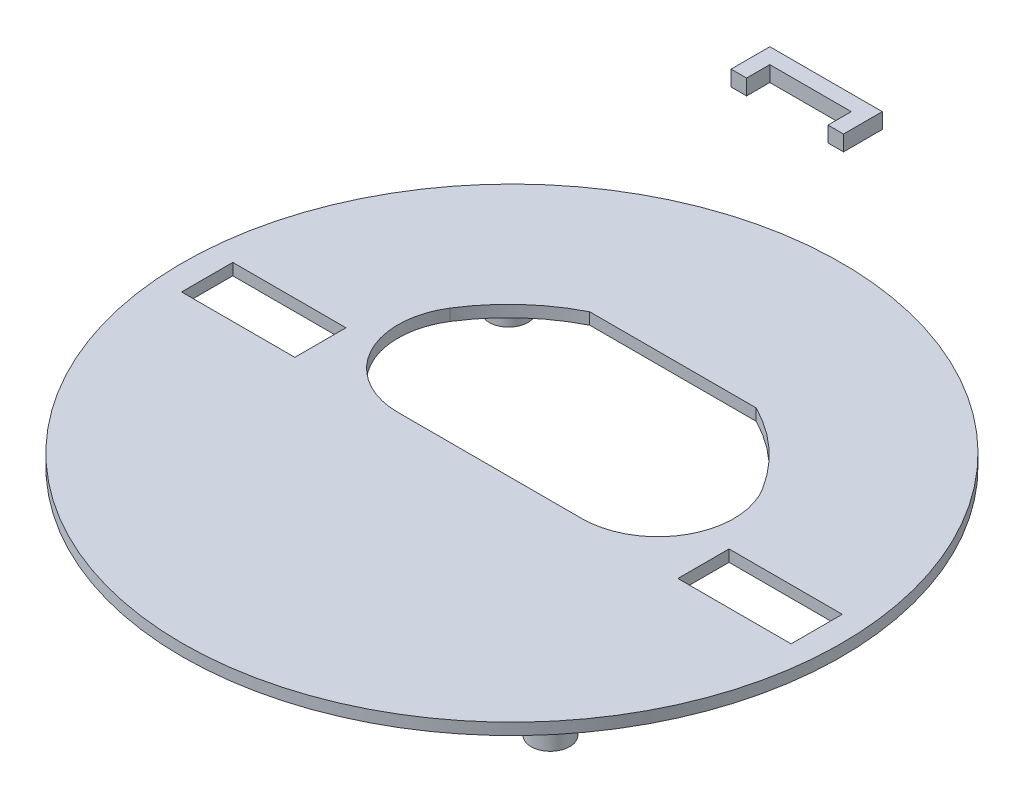
ISO-10303-21;
HEADER;
FILE_DESCRIPTION(('STEP AP214'),'2;1');
FILE_NAME('part.step','',(''),(''),'','','');
FILE_SCHEMA(('AUTOMOTIVE_DESIGN { 1 0 10303 214 1 1 1 1 }'));
ENDSEC;
DATA;
#1=APPLICATION_CONTEXT('core data for automotive mechanical design processes');
#2=APPLICATION_PROTOCOL_DEFINITION('international standard','automotive_design',2000,#1);
#3=PRODUCT_CONTEXT('',#1,'mechanical');
#4=PRODUCT('Part','Part','',(#3));
#5=PRODUCT_RELATED_PRODUCT_CATEGORY('part','',(#4));
#6=PRODUCT_DEFINITION_FORMATION('','',#4);
#7=PRODUCT_DEFINITION_CONTEXT('part definition',#1,'design');
#8=PRODUCT_DEFINITION('design','',#6,#7);
#9=PRODUCT_DEFINITION_SHAPE('','',#8);
#10=(LENGTH_UNIT() NAMED_UNIT(*) SI_UNIT(.MILLI.,.METRE.));
#11=(NAMED_UNIT(*) PLANE_ANGLE_UNIT() SI_UNIT($,.RADIAN.));
#12=(NAMED_UNIT(*) SI_UNIT($,.STERADIAN.) SOLID_ANGLE_UNIT());
#13=UNCERTAINTY_MEASURE_WITH_UNIT(LENGTH_MEASURE(1.E-05),#10,'distance_accuracy_value','');
#14=(GEOMETRIC_REPRESENTATION_CONTEXT(3) GLOBAL_UNCERTAINTY_ASSIGNED_CONTEXT((#13)) GLOBAL_UNIT_ASSIGNED_CONTEXT((#10,
#11,#12)) REPRESENTATION_CONTEXT('',''));
#15=CARTESIAN_POINT('',(0.,0.,0.));
#16=DIRECTION('',(0.,0.,1.));
#17=DIRECTION('',(1.,0.,0.));
#18=AXIS2_PLACEMENT_3D('',#15,#16,#17);
#19=CARTESIAN_POINT('',(0.,16.,0.));
#20=DIRECTION('',(0.,1.,0.));
#21=DIRECTION('',(0.,0.,1.));
#22=AXIS2_PLACEMENT_3D('',#19,#20,#21);
#23=PLANE('',#22);
#24=CARTESIAN_POINT('',(26.517708618087,16.,-23.1203329879293));
#25=DIRECTION('',(0.,1.,0.));
#26=DIRECTION('',(0.,0.,1.));
#27=AXIS2_PLACEMENT_3D('',#24,#25,#26);
#28=CIRCLE('',#27,2.5);
#29=CARTESIAN_POINT('',(26.517708618087,16.,-20.6203329879293));
#30=VERTEX_POINT('',#29);
#31=EDGE_CURVE('E13',#30,#30,#28,.F.);
#32=ORIENTED_EDGE('',*,*,#31,.F.);
#33=EDGE_LOOP('',(#32));
#34=FACE_BOUND('',#33,.T.);
#35=CARTESIAN_POINT('',(0.,16.,-30.8231453174272));
#36=DIRECTION('',(0.,1.,0.));
#37=DIRECTION('',(0.,0.,1.));
#38=AXIS2_PLACEMENT_3D('',#35,#36,#37);
#39=CIRCLE('',#38,2.5);
#40=CARTESIAN_POINT('',(0.,16.,-28.3231453174272));
#41=VERTEX_POINT('',#40);
#42=EDGE_CURVE('E55',#41,#41,#39,.F.);
#43=ORIENTED_EDGE('',*,*,#42,.F.);
#44=EDGE_LOOP('',(#43));
#45=FACE_BOUND('',#44,.T.);
#46=CARTESIAN_POINT('',(-23.5506451824083,16.,-23.1203329879293));
#47=DIRECTION('',(0.,1.,0.));
#48=DIRECTION('',(0.,0.,1.));
#49=AXIS2_PLACEMENT_3D('',#46,#47,#48);
#50=CIRCLE('',#49,2.5);
#51=CARTESIAN_POINT('',(-23.5506451824083,16.,-20.6203329879293));
#52=VERTEX_POINT('',#51);
#53=EDGE_CURVE('E292',#52,#52,#50,.F.);
#54=ORIENTED_EDGE('',*,*,#53,.F.);
#55=EDGE_LOOP('',(#54));
#56=FACE_BOUND('',#55,.T.);
#57=CARTESIAN_POINT('',(-26.0780813753172,16.,19.2039653158604));
#58=DIRECTION('',(0.,1.,0.));
#59=DIRECTION('',(0.,0.,1.));
#60=AXIS2_PLACEMENT_3D('',#57,#58,#59);
#61=CIRCLE('',#60,2.5);
#62=CARTESIAN_POINT('',(-26.0780813753172,16.,21.7039653158604));
#63=VERTEX_POINT('',#62);
#64=EDGE_CURVE('E289',#63,#63,#61,.F.);
#65=ORIENTED_EDGE('',*,*,#64,.F.);
#66=EDGE_LOOP('',(#65));
#67=FACE_BOUND('',#66,.T.);
#68=CARTESIAN_POINT('',(4.25566238891406,16.,31.3683060582832));
#69=DIRECTION('',(0.,1.,0.));
#70=DIRECTION('',(0.,0.,1.));
#71=AXIS2_PLACEMENT_3D('',#68,#69,#70);
#72=CIRCLE('',#71,2.5);
#73=CARTESIAN_POINT('',(4.25566238891406,16.,33.8683060582832));
#74=VERTEX_POINT('',#73);
#75=EDGE_CURVE('E286',#74,#74,#72,.F.);
#76=ORIENTED_EDGE('',*,*,#75,.F.);
#77=EDGE_LOOP('',(#76));
#78=FACE_BOUND('',#77,.T.);
#79=CARTESIAN_POINT('',(26.517708618087,16.,21.5542943782765));
#80=DIRECTION('',(0.,1.,0.));
#81=DIRECTION('',(0.,0.,1.));
#82=AXIS2_PLACEMENT_3D('',#79,#80,#81);
#83=CIRCLE('',#82,2.5);
#84=CARTESIAN_POINT('',(26.517708618087,16.,24.0542943782765));
#85=VERTEX_POINT('',#84);
#86=EDGE_CURVE('E217',#85,#85,#83,.F.);
#87=ORIENTED_EDGE('',*,*,#86,.F.);
#88=EDGE_LOOP('',(#87));
#89=FACE_BOUND('',#88,.T.);
#90=DIRECTION('',(0.,0.,-1.));
#91=VECTOR('',#90,1.);
#92=CARTESIAN_POINT('',(-24.7,16.,0.));
#93=LINE('',#92,#91);
#94=CARTESIAN_POINT('',(-24.7,16.,3.3));
#95=VERTEX_POINT('',#94);
#96=CARTESIAN_POINT('',(-24.7,16.,-3.3));
#97=VERTEX_POINT('',#96);
#98=EDGE_CURVE('E224',#95,#97,#93,.T.);
#99=ORIENTED_EDGE('',*,*,#98,.T.);
#100=DIRECTION('',(-1.,0.,0.));
#101=VECTOR('',#100,1.);
#102=CARTESIAN_POINT('',(0.,16.,-3.30000000000001));
#103=LINE('',#102,#101);
#104=CARTESIAN_POINT('',(-39.3,16.,-3.3));
#105=VERTEX_POINT('',#104);
#106=EDGE_CURVE('E70',#97,#105,#103,.T.);
#107=ORIENTED_EDGE('',*,*,#106,.T.);
#108=DIRECTION('',(0.,0.,1.));
#109=VECTOR('',#108,1.);
#110=CARTESIAN_POINT('',(-39.3,16.,0.));
#111=LINE('',#110,#109);
#112=CARTESIAN_POINT('',(-39.3,16.,3.3));
#113=VERTEX_POINT('',#112);
#114=EDGE_CURVE('E228',#105,#113,#111,.T.);
#115=ORIENTED_EDGE('',*,*,#114,.T.);
#116=DIRECTION('',(1.,0.,0.));
#117=VECTOR('',#116,1.);
#118=CARTESIAN_POINT('',(0.,16.,3.3));
#119=LINE('',#118,#117);
#120=EDGE_CURVE('E226',#113,#95,#119,.T.);
#121=ORIENTED_EDGE('',*,*,#120,.T.);
#122=EDGE_LOOP('',(#99,#107,#115,#121));
#123=FACE_BOUND('',#122,.T.);
#124=CARTESIAN_POINT('',(0.,16.,0.));
#125=DIRECTION('',(0.,1.,0.));
#126=DIRECTION('',(0.,0.,1.));
#127=AXIS2_PLACEMENT_3D('',#124,#125,#126);
#128=CIRCLE('',#127,42.5);
#129=CARTESIAN_POINT('',(0.,16.,42.5));
#130=VERTEX_POINT('',#129);
#131=EDGE_CURVE('E172',#130,#130,#128,.T.);
#132=ORIENTED_EDGE('',*,*,#131,.F.);
#133=EDGE_LOOP('',(#132));
#134=FACE_BOUND('',#133,.T.);
#135=DIRECTION('',(-1.,0.,0.));
#136=VECTOR('',#135,1.);
#137=CARTESIAN_POINT('',(0.,16.,-3.30000000000001));
#138=LINE('',#137,#136);
#139=CARTESIAN_POINT('',(39.3,16.,-3.30000000000001));
#140=VERTEX_POINT('',#139);
#141=CARTESIAN_POINT('',(24.7,16.,-3.30000000000001));
#142=VERTEX_POINT('',#141);
#143=EDGE_CURVE('E157',#140,#142,#138,.T.);
#144=ORIENTED_EDGE('',*,*,#143,.T.);
#145=DIRECTION('',(0.,0.,1.));
#146=VECTOR('',#145,1.);
#147=CARTESIAN_POINT('',(24.7,16.,0.));
#148=LINE('',#147,#146);
#149=CARTESIAN_POINT('',(24.7,16.,3.3));
#150=VERTEX_POINT('',#149);
#151=EDGE_CURVE('E62',#142,#150,#148,.T.);
#152=ORIENTED_EDGE('',*,*,#151,.T.);
#153=DIRECTION('',(1.,0.,0.));
#154=VECTOR('',#153,1.);
#155=CARTESIAN_POINT('',(0.,16.,3.3));
#156=LINE('',#155,#154);
#157=CARTESIAN_POINT('',(39.3,16.,3.3));
#158=VERTEX_POINT('',#157);
#159=EDGE_CURVE('E220',#150,#158,#156,.T.);
#160=ORIENTED_EDGE('',*,*,#159,.T.);
#161=DIRECTION('',(0.,0.,-1.));
#162=VECTOR('',#161,1.);
#163=CARTESIAN_POINT('',(39.3,16.,0.));
#164=LINE('',#163,#162);
#165=EDGE_CURVE('E218',#158,#140,#164,.T.);
#166=ORIENTED_EDGE('',*,*,#165,.T.);
#167=EDGE_LOOP('',(#144,#152,#160,#166));
#168=FACE_BOUND('',#167,.T.);
#169=CARTESIAN_POINT('',(-11.8918891996092,16.,-6.99999999999999));
#170=DIRECTION('',(0.,1.,0.));
#171=DIRECTION('',(0.,0.,1.));
#172=AXIS2_PLACEMENT_3D('',#169,#170,#171);
#173=CIRCLE('',#172,9.8);
#174=CARTESIAN_POINT('',(-20.1921569930206,16.,-12.2101395909952));
#175=VERTEX_POINT('',#174);
#176=CARTESIAN_POINT('',(-11.8918891996092,16.,2.80000000000001));
#177=VERTEX_POINT('',#176);
#178=EDGE_CURVE('E232',#175,#177,#173,.T.);
#179=ORIENTED_EDGE('',*,*,#178,.T.);
#180=DIRECTION('',(1.,0.,0.));
#181=VECTOR('',#180,1.);
#182=CARTESIAN_POINT('',(0.,16.,2.8));
#183=LINE('',#182,#181);
#184=CARTESIAN_POINT('',(11.8231616387094,16.,2.8));
#185=VERTEX_POINT('',#184);
#186=EDGE_CURVE('E246',#177,#185,#183,.T.);
#187=ORIENTED_EDGE('',*,*,#186,.T.);
#188=CARTESIAN_POINT('',(11.8231616387094,16.,-6.99999999999999));
#189=DIRECTION('',(0.,1.,0.));
#190=DIRECTION('',(0.,0.,1.));
#191=AXIS2_PLACEMENT_3D('',#188,#189,#190);
#192=CIRCLE('',#191,9.8);
#193=CARTESIAN_POINT('',(20.1234294321209,16.,-12.2101395909952));
#194=VERTEX_POINT('',#193);
#195=EDGE_CURVE('E243',#185,#194,#192,.T.);
#196=ORIENTED_EDGE('',*,*,#195,.T.);
#197=CARTESIAN_POINT('',(-0.0343637804498904,16.,0.443056558564638));
#198=DIRECTION('',(0.,1.,0.));
#199=DIRECTION('',(0.,0.,1.));
#200=AXIS2_PLACEMENT_3D('',#197,#198,#199);
#201=CIRCLE('',#200,23.8);
#202=CARTESIAN_POINT('',(10.6974835931212,16.,-20.8));
#203=VERTEX_POINT('',#202);
#204=EDGE_CURVE('E240',#194,#203,#201,.T.);
#205=ORIENTED_EDGE('',*,*,#204,.T.);
#206=DIRECTION('',(-1.,0.,0.));
#207=VECTOR('',#206,1.);
#208=CARTESIAN_POINT('',(0.,16.,-20.8));
#209=LINE('',#208,#207);
#210=CARTESIAN_POINT('',(-10.766211154021,16.,-20.8));
#211=VERTEX_POINT('',#210);
#212=EDGE_CURVE('E237',#203,#211,#209,.T.);
#213=ORIENTED_EDGE('',*,*,#212,.T.);
#214=CARTESIAN_POINT('',(-0.0343637804498904,16.,0.443056558564638));
#215=DIRECTION('',(0.,1.,0.));
#216=DIRECTION('',(0.,0.,1.));
#217=AXIS2_PLACEMENT_3D('',#214,#215,#216);
#218=CIRCLE('',#217,23.8);
#219=EDGE_CURVE('E235',#211,#175,#218,.T.);
#220=ORIENTED_EDGE('',*,*,#219,.T.);
#221=EDGE_LOOP('',(#179,#187,#196,#205,#213,#220));
#222=FACE_BOUND('',#221,.T.);
#223=ADVANCED_FACE('F48',(#34,#45,#56,#67,#78,#89,#123,#134,#168,#222),#23,.F.);
#224=CARTESIAN_POINT('',(0.,17.5,2.8));
#225=DIRECTION('',(0.,0.,-1.));
#226=DIRECTION('',(-1.,0.,0.));
#227=AXIS2_PLACEMENT_3D('',#224,#225,#226);
#228=PLANE('',#227);
#229=ORIENTED_EDGE('',*,*,#186,.F.);
#230=DIRECTION('',(0.,-1.,0.));
#231=VECTOR('',#230,1.);
#232=CARTESIAN_POINT('',(-11.8918891996092,17.5,2.80000000000001));
#233=LINE('',#232,#231);
#234=CARTESIAN_POINT('',(-11.8918891996092,17.5,2.80000000000001));
#235=VERTEX_POINT('',#234);
#236=EDGE_CURVE('E253',#235,#177,#233,.T.);
#237=ORIENTED_EDGE('',*,*,#236,.F.);
#238=DIRECTION('',(1.,0.,0.));
#239=VECTOR('',#238,1.);
#240=CARTESIAN_POINT('',(0.,17.5,2.8));
#241=LINE('',#240,#239);
#242=CARTESIAN_POINT('',(11.8231616387094,17.5,2.8));
#243=VERTEX_POINT('',#242);
#244=EDGE_CURVE('E209',#235,#243,#241,.T.);
#245=ORIENTED_EDGE('',*,*,#244,.T.);
#246=DIRECTION('',(0.,-1.,0.));
#247=VECTOR('',#246,1.);
#248=CARTESIAN_POINT('',(11.8231616387094,17.5,2.8));
#249=LINE('',#248,#247);
#250=EDGE_CURVE('E256',#243,#185,#249,.T.);
#251=ORIENTED_EDGE('',*,*,#250,.T.);
#252=EDGE_LOOP('',(#229,#237,#245,#251));
#253=FACE_BOUND('',#252,.T.);
#254=ADVANCED_FACE('F301',(#253),#228,.T.);
#255=CARTESIAN_POINT('',(11.8231616387094,17.5,-6.99999999999999));
#256=DIRECTION('',(0.,-1.,0.));
#257=DIRECTION('',(0.,0.,-1.));
#258=AXIS2_PLACEMENT_3D('',#255,#256,#257);
#259=CYLINDRICAL_SURFACE('',#258,9.8);
#260=ORIENTED_EDGE('',*,*,#195,.F.);
#261=ORIENTED_EDGE('',*,*,#250,.F.);
#262=CARTESIAN_POINT('',(11.8231616387094,17.5,-6.99999999999999));
#263=DIRECTION('',(0.,1.,0.));
#264=DIRECTION('',(0.,0.,1.));
#265=AXIS2_PLACEMENT_3D('',#262,#263,#264);
#266=CIRCLE('',#265,9.8);
#267=CARTESIAN_POINT('',(20.1234294321209,17.5,-12.2101395909952));
#268=VERTEX_POINT('',#267);
#269=EDGE_CURVE('E206',#243,#268,#266,.T.);
#270=ORIENTED_EDGE('',*,*,#269,.T.);
#271=DIRECTION('',(0.,-1.,0.));
#272=VECTOR('',#271,1.);
#273=CARTESIAN_POINT('',(20.1234294321209,17.5,-12.2101395909952));
#274=LINE('',#273,#272);
#275=EDGE_CURVE('E260',#268,#194,#274,.T.);
#276=ORIENTED_EDGE('',*,*,#275,.T.);
#277=EDGE_LOOP('',(#260,#261,#270,#276));
#278=FACE_BOUND('',#277,.T.);
#279=ADVANCED_FACE('F324',(#278),#259,.F.);
#280=CARTESIAN_POINT('',(-0.0343637804498904,17.5,0.443056558564638));
#281=DIRECTION('',(0.,-1.,0.));
#282=DIRECTION('',(0.,0.,-1.));
#283=AXIS2_PLACEMENT_3D('',#280,#281,#282);
#284=CYLINDRICAL_SURFACE('',#283,23.8);
#285=ORIENTED_EDGE('',*,*,#204,.F.);
#286=ORIENTED_EDGE('',*,*,#275,.F.);
#287=CARTESIAN_POINT('',(-0.0343637804498904,17.5,0.443056558564638));
#288=DIRECTION('',(0.,1.,0.));
#289=DIRECTION('',(0.,0.,1.));
#290=AXIS2_PLACEMENT_3D('',#287,#288,#289);
#291=CIRCLE('',#290,23.8);
#292=CARTESIAN_POINT('',(10.6974835931212,17.5,-20.8));
#293=VERTEX_POINT('',#292);
#294=EDGE_CURVE('E203',#268,#293,#291,.T.);
#295=ORIENTED_EDGE('',*,*,#294,.T.);
#296=DIRECTION('',(0.,-1.,0.));
#297=VECTOR('',#296,1.);
#298=CARTESIAN_POINT('',(10.6974835931212,17.5,-20.8));
#299=LINE('',#298,#297);
#300=EDGE_CURVE('E263',#293,#203,#299,.T.);
#301=ORIENTED_EDGE('',*,*,#300,.T.);
#302=EDGE_LOOP('',(#285,#286,#295,#301));
#303=FACE_BOUND('',#302,.T.);
#304=ADVANCED_FACE('F331',(#303),#284,.F.);
#305=CARTESIAN_POINT('',(-11.8918891996092,17.5,-6.99999999999999));
#306=DIRECTION('',(0.,-1.,0.));
#307=DIRECTION('',(0.,0.,-1.));
#308=AXIS2_PLACEMENT_3D('',#305,#306,#307);
#309=CYLINDRICAL_SURFACE('',#308,9.8);
#310=ORIENTED_EDGE('',*,*,#178,.F.);
#311=DIRECTION('',(0.,-1.,0.));
#312=VECTOR('',#311,1.);
#313=CARTESIAN_POINT('',(-20.1921569930206,17.5,-12.2101395909952));
#314=LINE('',#313,#312);
#315=CARTESIAN_POINT('',(-20.1921569930206,17.5,-12.2101395909952));
#316=VERTEX_POINT('',#315);
#317=EDGE_CURVE('E249',#316,#175,#314,.T.);
#318=ORIENTED_EDGE('',*,*,#317,.F.);
#319=CARTESIAN_POINT('',(-11.8918891996092,17.5,-6.99999999999999));
#320=DIRECTION('',(0.,1.,0.));
#321=DIRECTION('',(0.,0.,1.));
#322=AXIS2_PLACEMENT_3D('',#319,#320,#321);
#323=CIRCLE('',#322,9.8);
#324=EDGE_CURVE('E194',#316,#235,#323,.T.);
#325=ORIENTED_EDGE('',*,*,#324,.T.);
#326=ORIENTED_EDGE('',*,*,#236,.T.);
#327=EDGE_LOOP('',(#310,#318,#325,#326));
#328=FACE_BOUND('',#327,.T.);
#329=ADVANCED_FACE('F318',(#328),#309,.F.);
#330=CARTESIAN_POINT('',(0.,17.5,-3.30000000000001));
#331=DIRECTION('',(0.,0.,1.));
#332=DIRECTION('',(1.,0.,0.));
#333=AXIS2_PLACEMENT_3D('',#330,#331,#332);
#334=PLANE('',#333);
#335=ORIENTED_EDGE('',*,*,#106,.F.);
#336=DIRECTION('',(0.,-1.,0.));
#337=VECTOR('',#336,1.);
#338=CARTESIAN_POINT('',(-24.7,17.5,-3.3));
#339=LINE('',#338,#337);
#340=CARTESIAN_POINT('',(-24.7,17.5,-3.3));
#341=VERTEX_POINT('',#340);
#342=EDGE_CURVE('E160',#341,#97,#339,.T.);
#343=ORIENTED_EDGE('',*,*,#342,.F.);
#344=DIRECTION('',(-1.,0.,0.));
#345=VECTOR('',#344,1.);
#346=CARTESIAN_POINT('',(0.,17.5,-3.30000000000001));
#347=LINE('',#346,#345);
#348=CARTESIAN_POINT('',(-39.3,17.5,-3.3));
#349=VERTEX_POINT('',#348);
#350=EDGE_CURVE('E191',#341,#349,#347,.T.);
#351=ORIENTED_EDGE('',*,*,#350,.T.);
#352=DIRECTION('',(0.,-1.,0.));
#353=VECTOR('',#352,1.);
#354=CARTESIAN_POINT('',(-39.3,17.5,-3.3));
#355=LINE('',#354,#353);
#356=EDGE_CURVE('E273',#349,#105,#355,.T.);
#357=ORIENTED_EDGE('',*,*,#356,.T.);
#358=EDGE_LOOP('',(#335,#343,#351,#357));
#359=FACE_BOUND('',#358,.T.);
#360=ADVANCED_FACE('F352',(#359),#334,.T.);
#361=CARTESIAN_POINT('',(-24.7,17.5,0.));
#362=DIRECTION('',(-1.,0.,0.));
#363=DIRECTION('',(0.,0.,1.));
#364=AXIS2_PLACEMENT_3D('',#361,#362,#363);
#365=PLANE('',#364);
#366=ORIENTED_EDGE('',*,*,#98,.F.);
#367=DIRECTION('',(0.,-1.,0.));
#368=VECTOR('',#367,1.);
#369=CARTESIAN_POINT('',(-24.7,17.5,3.3));
#370=LINE('',#369,#368);
#371=CARTESIAN_POINT('',(-24.7,17.5,3.3));
#372=VERTEX_POINT('',#371);
#373=EDGE_CURVE('E257',#372,#95,#370,.T.);
#374=ORIENTED_EDGE('',*,*,#373,.F.);
#375=DIRECTION('',(0.,0.,-1.));
#376=VECTOR('',#375,1.);
#377=CARTESIAN_POINT('',(-24.7,17.5,0.));
#378=LINE('',#377,#376);
#379=EDGE_CURVE('E182',#372,#341,#378,.T.);
#380=ORIENTED_EDGE('',*,*,#379,.T.);
#381=ORIENTED_EDGE('',*,*,#342,.T.);
#382=EDGE_LOOP('',(#366,#374,#380,#381));
#383=FACE_BOUND('',#382,.T.);
#384=ADVANCED_FACE('F355',(#383),#365,.T.);
#385=CARTESIAN_POINT('',(24.7,17.5,0.));
#386=DIRECTION('',(1.,0.,0.));
#387=DIRECTION('',(0.,0.,-1.));
#388=AXIS2_PLACEMENT_3D('',#385,#386,#387);
#389=PLANE('',#388);
#390=ORIENTED_EDGE('',*,*,#151,.F.);
#391=DIRECTION('',(0.,-1.,0.));
#392=VECTOR('',#391,1.);
#393=CARTESIAN_POINT('',(24.7,17.5,-3.30000000000001));
#394=LINE('',#393,#392);
#395=CARTESIAN_POINT('',(24.7,17.5,-3.30000000000001));
#396=VERTEX_POINT('',#395);
#397=EDGE_CURVE('E215',#396,#142,#394,.T.);
#398=ORIENTED_EDGE('',*,*,#397,.F.);
#399=DIRECTION('',(0.,0.,1.));
#400=VECTOR('',#399,1.);
#401=CARTESIAN_POINT('',(24.7,17.5,0.));
#402=LINE('',#401,#400);
#403=CARTESIAN_POINT('',(24.7,17.5,3.3));
#404=VERTEX_POINT('',#403);
#405=EDGE_CURVE('E171',#396,#404,#402,.T.);
#406=ORIENTED_EDGE('',*,*,#405,.T.);
#407=DIRECTION('',(0.,-1.,0.));
#408=VECTOR('',#407,1.);
#409=CARTESIAN_POINT('',(24.7,17.5,3.3));
#410=LINE('',#409,#408);
#411=EDGE_CURVE('E281',#404,#150,#410,.T.);
#412=ORIENTED_EDGE('',*,*,#411,.T.);
#413=EDGE_LOOP('',(#390,#398,#406,#412));
#414=FACE_BOUND('',#413,.T.);
#415=ADVANCED_FACE('F365',(#414),#389,.T.);
#416=CARTESIAN_POINT('',(0.,17.5,-3.30000000000001));
#417=DIRECTION('',(0.,0.,1.));
#418=DIRECTION('',(1.,0.,0.));
#419=AXIS2_PLACEMENT_3D('',#416,#417,#418);
#420=PLANE('',#419);
#421=ORIENTED_EDGE('',*,*,#143,.F.);
#422=DIRECTION('',(0.,-1.,0.));
#423=VECTOR('',#422,1.);
#424=CARTESIAN_POINT('',(39.3,17.5,-3.30000000000001));
#425=LINE('',#424,#423);
#426=CARTESIAN_POINT('',(39.3,17.5,-3.30000000000001));
#427=VERTEX_POINT('',#426);
#428=EDGE_CURVE('E151',#427,#140,#425,.T.);
#429=ORIENTED_EDGE('',*,*,#428,.F.);
#430=DIRECTION('',(-1.,0.,0.));
#431=VECTOR('',#430,1.);
#432=CARTESIAN_POINT('',(0.,17.5,-3.30000000000001));
#433=LINE('',#432,#431);
#434=EDGE_CURVE('E155',#427,#396,#433,.T.);
#435=ORIENTED_EDGE('',*,*,#434,.T.);
#436=ORIENTED_EDGE('',*,*,#397,.T.);
#437=EDGE_LOOP('',(#421,#429,#435,#436));
#438=FACE_BOUND('',#437,.T.);
#439=ADVANCED_FACE('F153',(#438),#420,.T.);
#440=CARTESIAN_POINT('',(0.,17.5,0.));
#441=DIRECTION('',(0.,1.,0.));
#442=DIRECTION('',(0.,0.,1.));
#443=AXIS2_PLACEMENT_3D('',#440,#441,#442);
#444=PLANE('',#443);
#445=ORIENTED_EDGE('',*,*,#434,.F.);
#446=DIRECTION('',(0.,0.,-1.));
#447=VECTOR('',#446,1.);
#448=CARTESIAN_POINT('',(39.3,17.5,0.));
#449=LINE('',#448,#447);
#450=CARTESIAN_POINT('',(39.3,17.5,3.3));
#451=VERTEX_POINT('',#450);
#452=EDGE_CURVE('E168',#451,#427,#449,.T.);
#453=ORIENTED_EDGE('',*,*,#452,.F.);
#454=DIRECTION('',(1.,0.,0.));
#455=VECTOR('',#454,1.);
#456=CARTESIAN_POINT('',(0.,17.5,3.3));
#457=LINE('',#456,#455);
#458=EDGE_CURVE('E176',#404,#451,#457,.T.);
#459=ORIENTED_EDGE('',*,*,#458,.F.);
#460=ORIENTED_EDGE('',*,*,#405,.F.);
#461=EDGE_LOOP('',(#445,#453,#459,#460));
#462=FACE_BOUND('',#461,.T.);
#463=ORIENTED_EDGE('',*,*,#379,.F.);
#464=DIRECTION('',(1.,0.,0.));
#465=VECTOR('',#464,1.);
#466=CARTESIAN_POINT('',(0.,17.5,3.3));
#467=LINE('',#466,#465);
#468=CARTESIAN_POINT('',(-39.3,17.5,3.3));
#469=VERTEX_POINT('',#468);
#470=EDGE_CURVE('E185',#469,#372,#467,.T.);
#471=ORIENTED_EDGE('',*,*,#470,.F.);
#472=DIRECTION('',(0.,0.,1.));
#473=VECTOR('',#472,1.);
#474=CARTESIAN_POINT('',(-39.3,17.5,0.));
#475=LINE('',#474,#473);
#476=EDGE_CURVE('E188',#349,#469,#475,.T.);
#477=ORIENTED_EDGE('',*,*,#476,.F.);
#478=ORIENTED_EDGE('',*,*,#350,.F.);
#479=EDGE_LOOP('',(#463,#471,#477,#478));
#480=FACE_BOUND('',#479,.T.);
#481=ORIENTED_EDGE('',*,*,#324,.F.);
#482=CARTESIAN_POINT('',(-0.0343637804498904,17.5,0.443056558564638));
#483=DIRECTION('',(0.,1.,0.));
#484=DIRECTION('',(0.,0.,1.));
#485=AXIS2_PLACEMENT_3D('',#482,#483,#484);
#486=CIRCLE('',#485,23.8);
#487=CARTESIAN_POINT('',(-10.766211154021,17.5,-20.8));
#488=VERTEX_POINT('',#487);
#489=EDGE_CURVE('E197',#488,#316,#486,.T.);
#490=ORIENTED_EDGE('',*,*,#489,.F.);
#491=DIRECTION('',(-1.,0.,0.));
#492=VECTOR('',#491,1.);
#493=CARTESIAN_POINT('',(0.,17.5,-20.8));
#494=LINE('',#493,#492);
#495=EDGE_CURVE('E200',#293,#488,#494,.T.);
#496=ORIENTED_EDGE('',*,*,#495,.F.);
#497=ORIENTED_EDGE('',*,*,#294,.F.);
#498=ORIENTED_EDGE('',*,*,#269,.F.);
#499=ORIENTED_EDGE('',*,*,#244,.F.);
#500=EDGE_LOOP('',(#481,#490,#496,#497,#498,#499));
#501=FACE_BOUND('',#500,.T.);
#502=CARTESIAN_POINT('',(0.,17.5,0.));
#503=DIRECTION('',(0.,1.,0.));
#504=DIRECTION('',(0.,0.,1.));
#505=AXIS2_PLACEMENT_3D('',#502,#503,#504);
#506=CIRCLE('',#505,42.5);
#507=CARTESIAN_POINT('',(0.,17.5,42.5));
#508=VERTEX_POINT('',#507);
#509=EDGE_CURVE('E212',#508,#508,#506,.T.);
#510=ORIENTED_EDGE('',*,*,#509,.T.);
#511=EDGE_LOOP('',(#510));
#512=FACE_BOUND('',#511,.T.);
#513=ADVANCED_FACE('F165',(#462,#480,#501,#512),#444,.T.);
#514=CARTESIAN_POINT('',(0.,17.5,0.));
#515=DIRECTION('',(0.,-1.,0.));
#516=DIRECTION('',(0.,0.,-1.));
#517=AXIS2_PLACEMENT_3D('',#514,#515,#516);
#518=CYLINDRICAL_SURFACE('',#517,42.5);
#519=ORIENTED_EDGE('',*,*,#509,.F.);
#520=EDGE_LOOP('',(#519));
#521=FACE_BOUND('',#520,.T.);
#522=ORIENTED_EDGE('',*,*,#131,.T.);
#523=EDGE_LOOP('',(#522));
#524=FACE_BOUND('',#523,.T.);
#525=ADVANCED_FACE('F372',(#521,#524),#518,.T.);
#526=CARTESIAN_POINT('',(0.,17.5,3.3));
#527=DIRECTION('',(0.,0.,-1.));
#528=DIRECTION('',(-1.,0.,0.));
#529=AXIS2_PLACEMENT_3D('',#526,#527,#528);
#530=PLANE('',#529);
#531=ORIENTED_EDGE('',*,*,#159,.F.);
#532=ORIENTED_EDGE('',*,*,#411,.F.);
#533=ORIENTED_EDGE('',*,*,#458,.T.);
#534=DIRECTION('',(0.,-1.,0.));
#535=VECTOR('',#534,1.);
#536=CARTESIAN_POINT('',(39.3,17.5,3.3));
#537=LINE('',#536,#535);
#538=EDGE_CURVE('E161',#451,#158,#537,.T.);
#539=ORIENTED_EDGE('',*,*,#538,.T.);
#540=EDGE_LOOP('',(#531,#532,#533,#539));
#541=FACE_BOUND('',#540,.T.);
#542=ADVANCED_FACE('F369',(#541),#530,.T.);
#543=CARTESIAN_POINT('',(39.3,17.5,0.));
#544=DIRECTION('',(-1.,0.,0.));
#545=DIRECTION('',(0.,0.,1.));
#546=AXIS2_PLACEMENT_3D('',#543,#544,#545);
#547=PLANE('',#546);
#548=ORIENTED_EDGE('',*,*,#165,.F.);
#549=ORIENTED_EDGE('',*,*,#538,.F.);
#550=ORIENTED_EDGE('',*,*,#452,.T.);
#551=ORIENTED_EDGE('',*,*,#428,.T.);
#552=EDGE_LOOP('',(#548,#549,#550,#551));
#553=FACE_BOUND('',#552,.T.);
#554=ADVANCED_FACE('F174',(#553),#547,.T.);
#555=CARTESIAN_POINT('',(-39.3,17.5,0.));
#556=DIRECTION('',(1.,0.,0.));
#557=DIRECTION('',(0.,0.,-1.));
#558=AXIS2_PLACEMENT_3D('',#555,#556,#557);
#559=PLANE('',#558);
#560=ORIENTED_EDGE('',*,*,#114,.F.);
#561=ORIENTED_EDGE('',*,*,#356,.F.);
#562=ORIENTED_EDGE('',*,*,#476,.T.);
#563=DIRECTION('',(0.,-1.,0.));
#564=VECTOR('',#563,1.);
#565=CARTESIAN_POINT('',(-39.3,17.5,3.3));
#566=LINE('',#565,#564);
#567=EDGE_CURVE('E275',#469,#113,#566,.T.);
#568=ORIENTED_EDGE('',*,*,#567,.T.);
#569=EDGE_LOOP('',(#560,#561,#562,#568));
#570=FACE_BOUND('',#569,.T.);
#571=ADVANCED_FACE('F356',(#570),#559,.T.);
#572=CARTESIAN_POINT('',(0.,17.5,3.3));
#573=DIRECTION('',(0.,0.,-1.));
#574=DIRECTION('',(-1.,0.,0.));
#575=AXIS2_PLACEMENT_3D('',#572,#573,#574);
#576=PLANE('',#575);
#577=ORIENTED_EDGE('',*,*,#120,.F.);
#578=ORIENTED_EDGE('',*,*,#567,.F.);
#579=ORIENTED_EDGE('',*,*,#470,.T.);
#580=ORIENTED_EDGE('',*,*,#373,.T.);
#581=EDGE_LOOP('',(#577,#578,#579,#580));
#582=FACE_BOUND('',#581,.T.);
#583=ADVANCED_FACE('F346',(#582),#576,.T.);
#584=CARTESIAN_POINT('',(0.,17.5,-20.8));
#585=DIRECTION('',(0.,0.,1.));
#586=DIRECTION('',(1.,0.,0.));
#587=AXIS2_PLACEMENT_3D('',#584,#585,#586);
#588=PLANE('',#587);
#589=ORIENTED_EDGE('',*,*,#212,.F.);
#590=ORIENTED_EDGE('',*,*,#300,.F.);
#591=ORIENTED_EDGE('',*,*,#495,.T.);
#592=DIRECTION('',(0.,-1.,0.));
#593=VECTOR('',#592,1.);
#594=CARTESIAN_POINT('',(-10.766211154021,17.5,-20.8));
#595=LINE('',#594,#593);
#596=EDGE_CURVE('E266',#488,#211,#595,.T.);
#597=ORIENTED_EDGE('',*,*,#596,.T.);
#598=EDGE_LOOP('',(#589,#590,#591,#597));
#599=FACE_BOUND('',#598,.T.);
#600=ADVANCED_FACE('F333',(#599),#588,.T.);
#601=CARTESIAN_POINT('',(-0.0343637804498904,17.5,0.443056558564638));
#602=DIRECTION('',(0.,-1.,0.));
#603=DIRECTION('',(0.,0.,-1.));
#604=AXIS2_PLACEMENT_3D('',#601,#602,#603);
#605=CYLINDRICAL_SURFACE('',#604,23.8);
#606=ORIENTED_EDGE('',*,*,#219,.F.);
#607=ORIENTED_EDGE('',*,*,#596,.F.);
#608=ORIENTED_EDGE('',*,*,#489,.T.);
#609=ORIENTED_EDGE('',*,*,#317,.T.);
#610=EDGE_LOOP('',(#606,#607,#608,#609));
#611=FACE_BOUND('',#610,.T.);
#612=ADVANCED_FACE('F335',(#611),#605,.F.);
#613=CARTESIAN_POINT('',(26.517708618087,9.99999999999999,21.5542943782765));
#614=DIRECTION('',(0.,1.,0.));
#615=DIRECTION('',(0.,0.,1.));
#616=AXIS2_PLACEMENT_3D('',#613,#614,#615);
#617=CYLINDRICAL_SURFACE('',#616,2.5);
#618=CARTESIAN_POINT('',(26.517708618087,9.99999999999999,21.5542943782765));
#619=DIRECTION('',(0.,-1.,0.));
#620=DIRECTION('',(0.,0.,-1.));
#621=AXIS2_PLACEMENT_3D('',#618,#619,#620);
#622=CIRCLE('',#621,2.5);
#623=CARTESIAN_POINT('',(26.517708618087,9.99999999999999,19.0542943782765));
#624=VERTEX_POINT('',#623);
#625=EDGE_CURVE('E252',#624,#624,#622,.T.);
#626=ORIENTED_EDGE('',*,*,#625,.F.);
#627=EDGE_LOOP('',(#626));
#628=FACE_BOUND('',#627,.T.);
#629=ORIENTED_EDGE('',*,*,#86,.T.);
#630=EDGE_LOOP('',(#629));
#631=FACE_BOUND('',#630,.T.);
#632=ADVANCED_FACE('F337',(#628,#631),#617,.T.);
#633=CARTESIAN_POINT('',(26.517708618087,9.99999999999999,21.5542943782765));
#634=DIRECTION('',(0.,-1.,0.));
#635=DIRECTION('',(0.,0.,-1.));
#636=AXIS2_PLACEMENT_3D('',#633,#634,#635);
#637=PLANE('',#636);
#638=ORIENTED_EDGE('',*,*,#625,.T.);
#639=EDGE_LOOP('',(#638));
#640=FACE_BOUND('',#639,.T.);
#641=ADVANCED_FACE('F343',(#640),#637,.T.);
#642=CARTESIAN_POINT('',(4.25566238891406,9.99999999999999,31.3683060582832));
#643=DIRECTION('',(0.,1.,0.));
#644=DIRECTION('',(0.,0.,1.));
#645=AXIS2_PLACEMENT_3D('',#642,#643,#644);
#646=CYLINDRICAL_SURFACE('',#645,2.5);
#647=CARTESIAN_POINT('',(4.25566238891406,9.99999999999999,31.3683060582832));
#648=DIRECTION('',(0.,-1.,0.));
#649=DIRECTION('',(0.,0.,-1.));
#650=AXIS2_PLACEMENT_3D('',#647,#648,#649);
#651=CIRCLE('',#650,2.5);
#652=CARTESIAN_POINT('',(4.25566238891406,9.99999999999999,28.8683060582832));
#653=VERTEX_POINT('',#652);
#654=EDGE_CURVE('E595',#653,#653,#651,.T.);
#655=ORIENTED_EDGE('',*,*,#654,.F.);
#656=EDGE_LOOP('',(#655));
#657=FACE_BOUND('',#656,.T.);
#658=ORIENTED_EDGE('',*,*,#75,.T.);
#659=EDGE_LOOP('',(#658));
#660=FACE_BOUND('',#659,.T.);
#661=ADVANCED_FACE('F479',(#657,#660),#646,.T.);
#662=CARTESIAN_POINT('',(4.25566238891406,9.99999999999999,31.3683060582832));
#663=DIRECTION('',(0.,-1.,0.));
#664=DIRECTION('',(0.,0.,-1.));
#665=AXIS2_PLACEMENT_3D('',#662,#663,#664);
#666=PLANE('',#665);
#667=ORIENTED_EDGE('',*,*,#654,.T.);
#668=EDGE_LOOP('',(#667));
#669=FACE_BOUND('',#668,.T.);
#670=ADVANCED_FACE('F488',(#669),#666,.T.);
#671=CARTESIAN_POINT('',(-26.0780813753172,9.99999999999999,19.2039653158604));
#672=DIRECTION('',(0.,1.,0.));
#673=DIRECTION('',(0.,0.,1.));
#674=AXIS2_PLACEMENT_3D('',#671,#672,#673);
#675=CYLINDRICAL_SURFACE('',#674,2.5);
#676=CARTESIAN_POINT('',(-26.0780813753172,9.99999999999999,19.2039653158604));
#677=DIRECTION('',(0.,-1.,0.));
#678=DIRECTION('',(0.,0.,-1.));
#679=AXIS2_PLACEMENT_3D('',#676,#677,#678);
#680=CIRCLE('',#679,2.5);
#681=CARTESIAN_POINT('',(-26.0780813753172,9.99999999999999,16.7039653158604));
#682=VERTEX_POINT('',#681);
#683=EDGE_CURVE('E592',#682,#682,#680,.T.);
#684=ORIENTED_EDGE('',*,*,#683,.F.);
#685=EDGE_LOOP('',(#684));
#686=FACE_BOUND('',#685,.T.);
#687=ORIENTED_EDGE('',*,*,#64,.T.);
#688=EDGE_LOOP('',(#687));
#689=FACE_BOUND('',#688,.T.);
#690=ADVANCED_FACE('F498',(#686,#689),#675,.T.);
#691=CARTESIAN_POINT('',(-26.0780813753172,9.99999999999999,19.2039653158604));
#692=DIRECTION('',(0.,-1.,0.));
#693=DIRECTION('',(0.,0.,-1.));
#694=AXIS2_PLACEMENT_3D('',#691,#692,#693);
#695=PLANE('',#694);
#696=ORIENTED_EDGE('',*,*,#683,.T.);
#697=EDGE_LOOP('',(#696));
#698=FACE_BOUND('',#697,.T.);
#699=ADVANCED_FACE('F508',(#698),#695,.T.);
#700=CARTESIAN_POINT('',(-23.5506451824083,9.99999999999999,-23.1203329879293));
#701=DIRECTION('',(0.,1.,0.));
#702=DIRECTION('',(0.,0.,1.));
#703=AXIS2_PLACEMENT_3D('',#700,#701,#702);
#704=CYLINDRICAL_SURFACE('',#703,2.5);
#705=CARTESIAN_POINT('',(-23.5506451824083,9.99999999999999,-23.1203329879293));
#706=DIRECTION('',(0.,-1.,0.));
#707=DIRECTION('',(0.,0.,-1.));
#708=AXIS2_PLACEMENT_3D('',#705,#706,#707);
#709=CIRCLE('',#708,2.5);
#710=CARTESIAN_POINT('',(-23.5506451824083,9.99999999999999,-25.6203329879293));
#711=VERTEX_POINT('',#710);
#712=EDGE_CURVE('E587',#711,#711,#709,.T.);
#713=ORIENTED_EDGE('',*,*,#712,.F.);
#714=EDGE_LOOP('',(#713));
#715=FACE_BOUND('',#714,.T.);
#716=ORIENTED_EDGE('',*,*,#53,.T.);
#717=EDGE_LOOP('',(#716));
#718=FACE_BOUND('',#717,.T.);
#719=ADVANCED_FACE('F518',(#715,#718),#704,.T.);
#720=CARTESIAN_POINT('',(-23.5506451824083,9.99999999999999,-23.1203329879293));
#721=DIRECTION('',(0.,-1.,0.));
#722=DIRECTION('',(0.,0.,-1.));
#723=AXIS2_PLACEMENT_3D('',#720,#721,#722);
#724=PLANE('',#723);
#725=ORIENTED_EDGE('',*,*,#712,.T.);
#726=EDGE_LOOP('',(#725));
#727=FACE_BOUND('',#726,.T.);
#728=ADVANCED_FACE('F528',(#727),#724,.T.);
#729=CARTESIAN_POINT('',(0.,9.99999999999999,-30.8231453174272));
#730=DIRECTION('',(0.,1.,0.));
#731=DIRECTION('',(0.,0.,1.));
#732=AXIS2_PLACEMENT_3D('',#729,#730,#731);
#733=CYLINDRICAL_SURFACE('',#732,2.5);
#734=CARTESIAN_POINT('',(0.,9.99999999999999,-30.8231453174272));
#735=DIRECTION('',(0.,-1.,0.));
#736=DIRECTION('',(0.,0.,-1.));
#737=AXIS2_PLACEMENT_3D('',#734,#735,#736);
#738=CIRCLE('',#737,2.5);
#739=CARTESIAN_POINT('',(0.,9.99999999999999,-33.3231453174272));
#740=VERTEX_POINT('',#739);
#741=EDGE_CURVE('E584',#740,#740,#738,.T.);
#742=ORIENTED_EDGE('',*,*,#741,.F.);
#743=EDGE_LOOP('',(#742));
#744=FACE_BOUND('',#743,.T.);
#745=ORIENTED_EDGE('',*,*,#42,.T.);
#746=EDGE_LOOP('',(#745));
#747=FACE_BOUND('',#746,.T.);
#748=ADVANCED_FACE('F297',(#744,#747),#733,.T.);
#749=CARTESIAN_POINT('',(0.,9.99999999999999,-30.8231453174272));
#750=DIRECTION('',(0.,-1.,0.));
#751=DIRECTION('',(0.,0.,-1.));
#752=AXIS2_PLACEMENT_3D('',#749,#750,#751);
#753=PLANE('',#752);
#754=ORIENTED_EDGE('',*,*,#741,.T.);
#755=EDGE_LOOP('',(#754));
#756=FACE_BOUND('',#755,.T.);
#757=ADVANCED_FACE('F547',(#756),#753,.T.);
#758=CARTESIAN_POINT('',(26.517708618087,9.99999999999999,-23.1203329879293));
#759=DIRECTION('',(0.,1.,0.));
#760=DIRECTION('',(0.,0.,1.));
#761=AXIS2_PLACEMENT_3D('',#758,#759,#760);
#762=CYLINDRICAL_SURFACE('',#761,2.5);
#763=CARTESIAN_POINT('',(26.517708618087,9.99999999999999,-23.1203329879293));
#764=DIRECTION('',(0.,-1.,0.));
#765=DIRECTION('',(0.,0.,-1.));
#766=AXIS2_PLACEMENT_3D('',#763,#764,#765);
#767=CIRCLE('',#766,2.5);
#768=CARTESIAN_POINT('',(26.517708618087,9.99999999999999,-25.6203329879293));
#769=VERTEX_POINT('',#768);
#770=EDGE_CURVE('E583',#769,#769,#767,.T.);
#771=ORIENTED_EDGE('',*,*,#770,.F.);
#772=EDGE_LOOP('',(#771));
#773=FACE_BOUND('',#772,.T.);
#774=ORIENTED_EDGE('',*,*,#31,.T.);
#775=EDGE_LOOP('',(#774));
#776=FACE_BOUND('',#775,.T.);
#777=ADVANCED_FACE('F557',(#773,#776),#762,.T.);
#778=CARTESIAN_POINT('',(26.517708618087,9.99999999999999,-23.1203329879293));
#779=DIRECTION('',(0.,-1.,0.));
#780=DIRECTION('',(0.,0.,-1.));
#781=AXIS2_PLACEMENT_3D('',#778,#779,#780);
#782=PLANE('',#781);
#783=ORIENTED_EDGE('',*,*,#770,.T.);
#784=EDGE_LOOP('',(#783));
#785=FACE_BOUND('',#784,.T.);
#786=ADVANCED_FACE('F567',(#785),#782,.T.);
#787=CLOSED_SHELL('',(#223,#254,#279,#304,#329,#360,#384,#415,#439,#513,#525,#542,#554,#571,
#583,#600,#612,#632,#641,#661,#670,#690,#699,#719,#728,#748,#757,#777,#786));
#788=MANIFOLD_SOLID_BREP('B2',#787);
#789=CARTESIAN_POINT('',(-7.34035205732835,38.9181021954412,-38.5973512446351));
#790=DIRECTION('',(0.,0.,-1.));
#791=DIRECTION('',(-1.,0.,0.));
#792=AXIS2_PLACEMENT_3D('',#789,#790,#791);
#793=PLANE('',#792);
#794=DIRECTION('',(0.,1.,0.));
#795=VECTOR('',#794,1.);
#796=CARTESIAN_POINT('',(-5.34035205732835,38.9181021954412,-38.5973512446351));
#797=LINE('',#796,#795);
#798=CARTESIAN_POINT('',(-5.34035205732835,36.9181021954412,-38.5973512446351));
#799=VERTEX_POINT('',#798);
#800=CARTESIAN_POINT('',(-5.34035205732835,38.9181021954412,-38.5973512446351));
#801=VERTEX_POINT('',#800);
#802=EDGE_CURVE('E769',#799,#801,#797,.T.);
#803=ORIENTED_EDGE('',*,*,#802,.F.);
#804=DIRECTION('',(1.,0.,0.));
#805=VECTOR('',#804,1.);
#806=CARTESIAN_POINT('',(-7.34035205732835,36.9181021954412,-38.5973512446351));
#807=LINE('',#806,#805);
#808=CARTESIAN_POINT('',(5.15964794267165,36.9181021954412,-38.5973512446351));
#809=VERTEX_POINT('',#808);
#810=EDGE_CURVE('E773',#799,#809,#807,.T.);
#811=ORIENTED_EDGE('',*,*,#810,.T.);
#812=DIRECTION('',(0.,1.,0.));
#813=VECTOR('',#812,1.);
#814=CARTESIAN_POINT('',(5.15964794267165,38.9181021954412,-38.5973512446351));
#815=LINE('',#814,#813);
#816=CARTESIAN_POINT('',(5.15964794267165,38.9181021954412,-38.5973512446351));
#817=VERTEX_POINT('',#816);
#818=EDGE_CURVE('E770',#809,#817,#815,.T.);
#819=ORIENTED_EDGE('',*,*,#818,.T.);
#820=DIRECTION('',(1.,0.,0.));
#821=VECTOR('',#820,1.);
#822=CARTESIAN_POINT('',(-7.34035205732835,38.9181021954412,-38.5973512446351));
#823=LINE('',#822,#821);
#824=EDGE_CURVE('E652',#801,#817,#823,.T.);
#825=ORIENTED_EDGE('',*,*,#824,.F.);
#826=EDGE_LOOP('',(#803,#811,#819,#825));
#827=FACE_BOUND('',#826,.T.);
#828=ADVANCED_FACE('F637',(#827),#793,.F.);
#829=CARTESIAN_POINT('',(-7.34035205732835,38.9181021954412,-40.5973512446351));
#830=DIRECTION('',(0.,0.,1.));
#831=DIRECTION('',(1.,0.,0.));
#832=AXIS2_PLACEMENT_3D('',#829,#830,#831);
#833=PLANE('',#832);
#834=DIRECTION('',(0.,-1.,0.));
#835=VECTOR('',#834,1.);
#836=CARTESIAN_POINT('',(-5.34035205732835,38.9181021954412,-40.5973512446351));
#837=LINE('',#836,#835);
#838=CARTESIAN_POINT('',(-5.34035205732835,38.9181021954412,-40.5973512446351));
#839=VERTEX_POINT('',#838);
#840=CARTESIAN_POINT('',(-5.34035205732835,36.9181021954412,-40.5973512446351));
#841=VERTEX_POINT('',#840);
#842=EDGE_CURVE('E46',#839,#841,#837,.T.);
#843=ORIENTED_EDGE('',*,*,#842,.F.);
#844=DIRECTION('',(1.,0.,0.));
#845=VECTOR('',#844,1.);
#846=CARTESIAN_POINT('',(-7.34035205732835,38.9181021954412,-40.5973512446351));
#847=LINE('',#846,#845);
#848=CARTESIAN_POINT('',(5.15964794267165,38.9181021954412,-40.5973512446351));
#849=VERTEX_POINT('',#848);
#850=EDGE_CURVE('E780',#839,#849,#847,.T.);
#851=ORIENTED_EDGE('',*,*,#850,.T.);
#852=DIRECTION('',(0.,-1.,0.));
#853=VECTOR('',#852,1.);
#854=CARTESIAN_POINT('',(5.15964794267165,38.9181021954412,-40.5973512446351));
#855=LINE('',#854,#853);
#856=CARTESIAN_POINT('',(5.15964794267165,36.9181021954412,-40.5973512446351));
#857=VERTEX_POINT('',#856);
#858=EDGE_CURVE('E738',#849,#857,#855,.T.);
#859=ORIENTED_EDGE('',*,*,#858,.T.);
#860=DIRECTION('',(1.,0.,0.));
#861=VECTOR('',#860,1.);
#862=CARTESIAN_POINT('',(-7.34035205732835,36.9181021954412,-40.5973512446351));
#863=LINE('',#862,#861);
#864=EDGE_CURVE('E778',#841,#857,#863,.T.);
#865=ORIENTED_EDGE('',*,*,#864,.F.);
#866=EDGE_LOOP('',(#843,#851,#859,#865));
#867=FACE_BOUND('',#866,.T.);
#868=ADVANCED_FACE('F842',(#867),#833,.F.);
#869=CARTESIAN_POINT('',(5.15964794267165,38.9181021954412,-40.6));
#870=DIRECTION('',(1.,0.,0.));
#871=DIRECTION('',(0.,0.,-1.));
#872=AXIS2_PLACEMENT_3D('',#869,#870,#871);
#873=PLANE('',#872);
#874=ORIENTED_EDGE('',*,*,#818,.F.);
#875=DIRECTION('',(0.,0.,1.));
#876=VECTOR('',#875,1.);
#877=CARTESIAN_POINT('',(5.15964794267165,36.9181021954412,-40.6));
#878=LINE('',#877,#876);
#879=CARTESIAN_POINT('',(5.15964794267165,36.9181021954412,-35.6));
#880=VERTEX_POINT('',#879);
#881=EDGE_CURVE('E794',#809,#880,#878,.T.);
#882=ORIENTED_EDGE('',*,*,#881,.T.);
#883=DIRECTION('',(0.,1.,0.));
#884=VECTOR('',#883,1.);
#885=CARTESIAN_POINT('',(5.15964794267165,38.9181021954412,-35.6));
#886=LINE('',#885,#884);
#887=CARTESIAN_POINT('',(5.15964794267165,38.9181021954412,-35.6));
#888=VERTEX_POINT('',#887);
#889=EDGE_CURVE('E783',#880,#888,#886,.T.);
#890=ORIENTED_EDGE('',*,*,#889,.T.);
#891=DIRECTION('',(0.,0.,1.));
#892=VECTOR('',#891,1.);
#893=CARTESIAN_POINT('',(5.15964794267165,38.9181021954412,-40.6));
#894=LINE('',#893,#892);
#895=EDGE_CURVE('E811',#817,#888,#894,.T.);
#896=ORIENTED_EDGE('',*,*,#895,.F.);
#897=EDGE_LOOP('',(#874,#882,#890,#896));
#898=FACE_BOUND('',#897,.T.);
#899=ADVANCED_FACE('F639',(#898),#873,.F.);
#900=ORIENTED_EDGE('',*,*,#858,.F.);
#901=CARTESIAN_POINT('',(5.15964794267165,38.9181021954412,-40.6));
#902=VERTEX_POINT('',#901);
#903=EDGE_CURVE('E645',#902,#849,#894,.T.);
#904=ORIENTED_EDGE('',*,*,#903,.F.);
#905=DIRECTION('',(0.,1.,0.));
#906=VECTOR('',#905,1.);
#907=CARTESIAN_POINT('',(5.15964794267165,38.9181021954412,-40.6));
#908=LINE('',#907,#906);
#909=CARTESIAN_POINT('',(5.15964794267165,36.9181021954412,-40.6));
#910=VERTEX_POINT('',#909);
#911=EDGE_CURVE('E784',#910,#902,#908,.T.);
#912=ORIENTED_EDGE('',*,*,#911,.F.);
#913=EDGE_CURVE('E803',#910,#857,#878,.T.);
#914=ORIENTED_EDGE('',*,*,#913,.T.);
#915=EDGE_LOOP('',(#900,#904,#912,#914));
#916=FACE_BOUND('',#915,.T.);
#917=ADVANCED_FACE('F838',(#916),#873,.F.);
#918=CARTESIAN_POINT('',(7.15964794267165,38.9181021954412,-40.6));
#919=DIRECTION('',(0.,-1.,0.));
#920=DIRECTION('',(0.,0.,-1.));
#921=AXIS2_PLACEMENT_3D('',#918,#919,#920);
#922=PLANE('',#921);
#923=DIRECTION('',(0.,0.,-1.));
#924=VECTOR('',#923,1.);
#925=CARTESIAN_POINT('',(-7.34035205732835,38.9181021954412,-40.5973512446351));
#926=LINE('',#925,#924);
#927=CARTESIAN_POINT('',(-7.34035205732835,38.9181021954412,-35.6));
#928=VERTEX_POINT('',#927);
#929=CARTESIAN_POINT('',(-7.34035205732835,38.9181021954412,-40.6));
#930=VERTEX_POINT('',#929);
#931=EDGE_CURVE('E727',#928,#930,#926,.T.);
#932=ORIENTED_EDGE('',*,*,#931,.F.);
#933=DIRECTION('',(1.,0.,0.));
#934=VECTOR('',#933,1.);
#935=CARTESIAN_POINT('',(-5.34035205732835,38.9181021954412,-35.6));
#936=LINE('',#935,#934);
#937=CARTESIAN_POINT('',(-5.34035205732835,38.9181021954412,-35.6));
#938=VERTEX_POINT('',#937);
#939=EDGE_CURVE('E762',#928,#938,#936,.T.);
#940=ORIENTED_EDGE('',*,*,#939,.T.);
#941=DIRECTION('',(0.,0.,1.));
#942=VECTOR('',#941,1.);
#943=CARTESIAN_POINT('',(-5.34035205732835,38.9181021954412,-40.6));
#944=LINE('',#943,#942);
#945=EDGE_CURVE('E767',#801,#938,#944,.T.);
#946=ORIENTED_EDGE('',*,*,#945,.F.);
#947=ORIENTED_EDGE('',*,*,#824,.T.);
#948=ORIENTED_EDGE('',*,*,#895,.T.);
#949=DIRECTION('',(1.,0.,0.));
#950=VECTOR('',#949,1.);
#951=CARTESIAN_POINT('',(7.15964794267165,38.9181021954412,-35.6));
#952=LINE('',#951,#950);
#953=CARTESIAN_POINT('',(7.15964794267165,38.9181021954412,-35.6));
#954=VERTEX_POINT('',#953);
#955=EDGE_CURVE('E797',#888,#954,#952,.T.);
#956=ORIENTED_EDGE('',*,*,#955,.T.);
#957=DIRECTION('',(0.,0.,1.));
#958=VECTOR('',#957,1.);
#959=CARTESIAN_POINT('',(7.15964794267165,38.9181021954412,-40.6));
#960=LINE('',#959,#958);
#961=CARTESIAN_POINT('',(7.15964794267165,38.9181021954412,-40.6));
#962=VERTEX_POINT('',#961);
#963=EDGE_CURVE('E809',#962,#954,#960,.T.);
#964=ORIENTED_EDGE('',*,*,#963,.F.);
#965=DIRECTION('',(1.,0.,0.));
#966=VECTOR('',#965,1.);
#967=CARTESIAN_POINT('',(7.15964794267165,38.9181021954412,-40.6));
#968=LINE('',#967,#966);
#969=EDGE_CURVE('E787',#902,#962,#968,.T.);
#970=ORIENTED_EDGE('',*,*,#969,.F.);
#971=ORIENTED_EDGE('',*,*,#903,.T.);
#972=ORIENTED_EDGE('',*,*,#850,.F.);
#973=CARTESIAN_POINT('',(-5.34035205732835,38.9181021954412,-40.6));
#974=VERTEX_POINT('',#973);
#975=EDGE_CURVE('E744',#974,#839,#944,.T.);
#976=ORIENTED_EDGE('',*,*,#975,.F.);
#977=DIRECTION('',(1.,0.,0.));
#978=VECTOR('',#977,1.);
#979=CARTESIAN_POINT('',(-5.34035205732835,38.9181021954412,-40.6));
#980=LINE('',#979,#978);
#981=EDGE_CURVE('E741',#930,#974,#980,.T.);
#982=ORIENTED_EDGE('',*,*,#981,.F.);
#983=EDGE_LOOP('',(#932,#940,#946,#947,#948,#956,#964,#970,#971,#972,#976,#982));
#984=FACE_BOUND('',#983,.T.);
#985=ADVANCED_FACE('F742',(#984),#922,.F.);
#986=CARTESIAN_POINT('',(7.15964794267165,38.9181021954412,-40.6));
#987=DIRECTION('',(-1.,0.,0.));
#988=DIRECTION('',(0.,0.,1.));
#989=AXIS2_PLACEMENT_3D('',#986,#987,#988);
#990=PLANE('',#989);
#991=DIRECTION('',(0.,-1.,0.));
#992=VECTOR('',#991,1.);
#993=CARTESIAN_POINT('',(7.15964794267165,38.9181021954412,-35.6));
#994=LINE('',#993,#992);
#995=CARTESIAN_POINT('',(7.15964794267165,36.9181021954412,-35.6));
#996=VERTEX_POINT('',#995);
#997=EDGE_CURVE('E799',#954,#996,#994,.T.);
#998=ORIENTED_EDGE('',*,*,#997,.T.);
#999=DIRECTION('',(0.,0.,1.));
#1000=VECTOR('',#999,1.);
#1001=CARTESIAN_POINT('',(7.15964794267165,36.9181021954412,-40.6));
#1002=LINE('',#1001,#1000);
#1003=CARTESIAN_POINT('',(7.15964794267165,36.9181021954412,-40.6));
#1004=VERTEX_POINT('',#1003);
#1005=EDGE_CURVE('E806',#1004,#996,#1002,.T.);
#1006=ORIENTED_EDGE('',*,*,#1005,.F.);
#1007=DIRECTION('',(0.,-1.,0.));
#1008=VECTOR('',#1007,1.);
#1009=CARTESIAN_POINT('',(7.15964794267165,38.9181021954412,-40.6));
#1010=LINE('',#1009,#1008);
#1011=EDGE_CURVE('E790',#962,#1004,#1010,.T.);
#1012=ORIENTED_EDGE('',*,*,#1011,.F.);
#1013=ORIENTED_EDGE('',*,*,#963,.T.);
#1014=EDGE_LOOP('',(#998,#1006,#1012,#1013));
#1015=FACE_BOUND('',#1014,.T.);
#1016=ADVANCED_FACE('F832',(#1015),#990,.F.);
#1017=CARTESIAN_POINT('',(7.15964794267165,36.9181021954412,-40.6));
#1018=DIRECTION('',(0.,1.,0.));
#1019=DIRECTION('',(0.,0.,1.));
#1020=AXIS2_PLACEMENT_3D('',#1017,#1018,#1019);
#1021=PLANE('',#1020);
#1022=DIRECTION('',(0.,0.,1.));
#1023=VECTOR('',#1022,1.);
#1024=CARTESIAN_POINT('',(-7.34035205732835,36.9181021954412,-40.5973512446351));
#1025=LINE('',#1024,#1023);
#1026=CARTESIAN_POINT('',(-7.34035205732835,36.9181021954412,-40.6));
#1027=VERTEX_POINT('',#1026);
#1028=CARTESIAN_POINT('',(-7.34035205732835,36.9181021954412,-35.6));
#1029=VERTEX_POINT('',#1028);
#1030=EDGE_CURVE('E737',#1027,#1029,#1025,.T.);
#1031=ORIENTED_EDGE('',*,*,#1030,.F.);
#1032=DIRECTION('',(-1.,0.,0.));
#1033=VECTOR('',#1032,1.);
#1034=CARTESIAN_POINT('',(-5.34035205732835,36.9181021954412,-40.6));
#1035=LINE('',#1034,#1033);
#1036=CARTESIAN_POINT('',(-5.34035205732835,36.9181021954412,-40.6));
#1037=VERTEX_POINT('',#1036);
#1038=EDGE_CURVE('E751',#1037,#1027,#1035,.T.);
#1039=ORIENTED_EDGE('',*,*,#1038,.F.);
#1040=DIRECTION('',(0.,0.,1.));
#1041=VECTOR('',#1040,1.);
#1042=CARTESIAN_POINT('',(-5.34035205732835,36.9181021954412,-40.6));
#1043=LINE('',#1042,#1041);
#1044=EDGE_CURVE('E660',#1037,#841,#1043,.T.);
#1045=ORIENTED_EDGE('',*,*,#1044,.T.);
#1046=ORIENTED_EDGE('',*,*,#864,.T.);
#1047=ORIENTED_EDGE('',*,*,#913,.F.);
#1048=DIRECTION('',(-1.,0.,0.));
#1049=VECTOR('',#1048,1.);
#1050=CARTESIAN_POINT('',(7.15964794267165,36.9181021954412,-40.6));
#1051=LINE('',#1050,#1049);
#1052=EDGE_CURVE('E792',#1004,#910,#1051,.T.);
#1053=ORIENTED_EDGE('',*,*,#1052,.F.);
#1054=ORIENTED_EDGE('',*,*,#1005,.T.);
#1055=DIRECTION('',(-1.,0.,0.));
#1056=VECTOR('',#1055,1.);
#1057=CARTESIAN_POINT('',(7.15964794267165,36.9181021954412,-35.6));
#1058=LINE('',#1057,#1056);
#1059=EDGE_CURVE('E788',#996,#880,#1058,.T.);
#1060=ORIENTED_EDGE('',*,*,#1059,.T.);
#1061=ORIENTED_EDGE('',*,*,#881,.F.);
#1062=ORIENTED_EDGE('',*,*,#810,.F.);
#1063=CARTESIAN_POINT('',(-5.34035205732835,36.9181021954412,-35.6));
#1064=VERTEX_POINT('',#1063);
#1065=EDGE_CURVE('E760',#799,#1064,#1043,.T.);
#1066=ORIENTED_EDGE('',*,*,#1065,.T.);
#1067=DIRECTION('',(-1.,0.,0.));
#1068=VECTOR('',#1067,1.);
#1069=CARTESIAN_POINT('',(-5.34035205732835,36.9181021954412,-35.6));
#1070=LINE('',#1069,#1068);
#1071=EDGE_CURVE('E752',#1064,#1029,#1070,.T.);
#1072=ORIENTED_EDGE('',*,*,#1071,.T.);
#1073=EDGE_LOOP('',(#1031,#1039,#1045,#1046,#1047,#1053,#1054,#1060,#1061,#1062,#1066,#1072));
#1074=FACE_BOUND('',#1073,.T.);
#1075=ADVANCED_FACE('F826',(#1074),#1021,.F.);
#1076=CARTESIAN_POINT('',(0.,0.,-40.6));
#1077=DIRECTION('',(0.,0.,-1.));
#1078=DIRECTION('',(-1.,0.,0.));
#1079=AXIS2_PLACEMENT_3D('',#1076,#1077,#1078);
#1080=PLANE('',#1079);
#1081=ORIENTED_EDGE('',*,*,#911,.T.);
#1082=ORIENTED_EDGE('',*,*,#969,.T.);
#1083=ORIENTED_EDGE('',*,*,#1011,.T.);
#1084=ORIENTED_EDGE('',*,*,#1052,.T.);
#1085=EDGE_LOOP('',(#1081,#1082,#1083,#1084));
#1086=FACE_BOUND('',#1085,.T.);
#1087=ADVANCED_FACE('F835',(#1086),#1080,.T.);
#1088=CARTESIAN_POINT('',(0.,0.,-35.6));
#1089=DIRECTION('',(0.,0.,-1.));
#1090=DIRECTION('',(-1.,0.,0.));
#1091=AXIS2_PLACEMENT_3D('',#1088,#1089,#1090);
#1092=PLANE('',#1091);
#1093=ORIENTED_EDGE('',*,*,#889,.F.);
#1094=ORIENTED_EDGE('',*,*,#1059,.F.);
#1095=ORIENTED_EDGE('',*,*,#997,.F.);
#1096=ORIENTED_EDGE('',*,*,#955,.F.);
#1097=EDGE_LOOP('',(#1093,#1094,#1095,#1096));
#1098=FACE_BOUND('',#1097,.T.);
#1099=ADVANCED_FACE('F823',(#1098),#1092,.F.);
#1100=CARTESIAN_POINT('',(-7.34035205732835,0.,0.));
#1101=DIRECTION('',(-1.,0.,0.));
#1102=DIRECTION('',(0.,0.,1.));
#1103=AXIS2_PLACEMENT_3D('',#1100,#1101,#1102);
#1104=PLANE('',#1103);
#1105=ORIENTED_EDGE('',*,*,#1030,.T.);
#1106=DIRECTION('',(0.,1.,0.));
#1107=VECTOR('',#1106,1.);
#1108=CARTESIAN_POINT('',(-7.34035205732835,38.9181021954412,-35.6));
#1109=LINE('',#1108,#1107);
#1110=EDGE_CURVE('E733',#1029,#928,#1109,.T.);
#1111=ORIENTED_EDGE('',*,*,#1110,.T.);
#1112=ORIENTED_EDGE('',*,*,#931,.T.);
#1113=DIRECTION('',(0.,1.,0.));
#1114=VECTOR('',#1113,1.);
#1115=CARTESIAN_POINT('',(-7.34035205732835,38.9181021954412,-40.6));
#1116=LINE('',#1115,#1114);
#1117=EDGE_CURVE('E731',#1027,#930,#1116,.T.);
#1118=ORIENTED_EDGE('',*,*,#1117,.F.);
#1119=EDGE_LOOP('',(#1105,#1111,#1112,#1118));
#1120=FACE_BOUND('',#1119,.T.);
#1121=ADVANCED_FACE('F729',(#1120),#1104,.T.);
#1122=CARTESIAN_POINT('',(0.,0.,-40.6));
#1123=DIRECTION('',(0.,0.,-1.));
#1124=DIRECTION('',(-1.,0.,0.));
#1125=AXIS2_PLACEMENT_3D('',#1122,#1123,#1124);
#1126=PLANE('',#1125);
#1127=ORIENTED_EDGE('',*,*,#1117,.T.);
#1128=ORIENTED_EDGE('',*,*,#981,.T.);
#1129=DIRECTION('',(0.,-1.,0.));
#1130=VECTOR('',#1129,1.);
#1131=CARTESIAN_POINT('',(-5.34035205732835,38.9181021954412,-40.6));
#1132=LINE('',#1131,#1130);
#1133=EDGE_CURVE('E747',#974,#1037,#1132,.T.);
#1134=ORIENTED_EDGE('',*,*,#1133,.T.);
#1135=ORIENTED_EDGE('',*,*,#1038,.T.);
#1136=EDGE_LOOP('',(#1127,#1128,#1134,#1135));
#1137=FACE_BOUND('',#1136,.T.);
#1138=ADVANCED_FACE('F750',(#1137),#1126,.T.);
#1139=CARTESIAN_POINT('',(-5.34035205732835,38.9181021954412,-40.6));
#1140=DIRECTION('',(-1.,0.,0.));
#1141=DIRECTION('',(0.,0.,1.));
#1142=AXIS2_PLACEMENT_3D('',#1139,#1140,#1141);
#1143=PLANE('',#1142);
#1144=ORIENTED_EDGE('',*,*,#975,.T.);
#1145=ORIENTED_EDGE('',*,*,#842,.T.);
#1146=ORIENTED_EDGE('',*,*,#1044,.F.);
#1147=ORIENTED_EDGE('',*,*,#1133,.F.);
#1148=EDGE_LOOP('',(#1144,#1145,#1146,#1147));
#1149=FACE_BOUND('',#1148,.T.);
#1150=ADVANCED_FACE('F844',(#1149),#1143,.F.);
#1151=ORIENTED_EDGE('',*,*,#1065,.F.);
#1152=ORIENTED_EDGE('',*,*,#802,.T.);
#1153=ORIENTED_EDGE('',*,*,#945,.T.);
#1154=DIRECTION('',(0.,-1.,0.));
#1155=VECTOR('',#1154,1.);
#1156=CARTESIAN_POINT('',(-5.34035205732835,38.9181021954412,-35.6));
#1157=LINE('',#1156,#1155);
#1158=EDGE_CURVE('E755',#938,#1064,#1157,.T.);
#1159=ORIENTED_EDGE('',*,*,#1158,.T.);
#1160=EDGE_LOOP('',(#1151,#1152,#1153,#1159));
#1161=FACE_BOUND('',#1160,.T.);
#1162=ADVANCED_FACE('F851',(#1161),#1143,.F.);
#1163=CARTESIAN_POINT('',(0.,0.,-35.6));
#1164=DIRECTION('',(0.,0.,-1.));
#1165=DIRECTION('',(-1.,0.,0.));
#1166=AXIS2_PLACEMENT_3D('',#1163,#1164,#1165);
#1167=PLANE('',#1166);
#1168=ORIENTED_EDGE('',*,*,#1110,.F.);
#1169=ORIENTED_EDGE('',*,*,#1071,.F.);
#1170=ORIENTED_EDGE('',*,*,#1158,.F.);
#1171=ORIENTED_EDGE('',*,*,#939,.F.);
#1172=EDGE_LOOP('',(#1168,#1169,#1170,#1171));
#1173=FACE_BOUND('',#1172,.T.);
#1174=ADVANCED_FACE('F849',(#1173),#1167,.F.);
#1175=CLOSED_SHELL('',(#828,#868,#899,#917,#985,#1016,#1075,#1087,#1099,#1121,#1138,#1150,#1162,#1174));
#1176=MANIFOLD_SOLID_BREP('B7',#1175);
#1177=ADVANCED_BREP_SHAPE_REPRESENTATION('',(#18,#788,#1176),#14);
#1178=SHAPE_DEFINITION_REPRESENTATION(#9,#1177);
ENDSEC;
END-ISO-10303-21;
